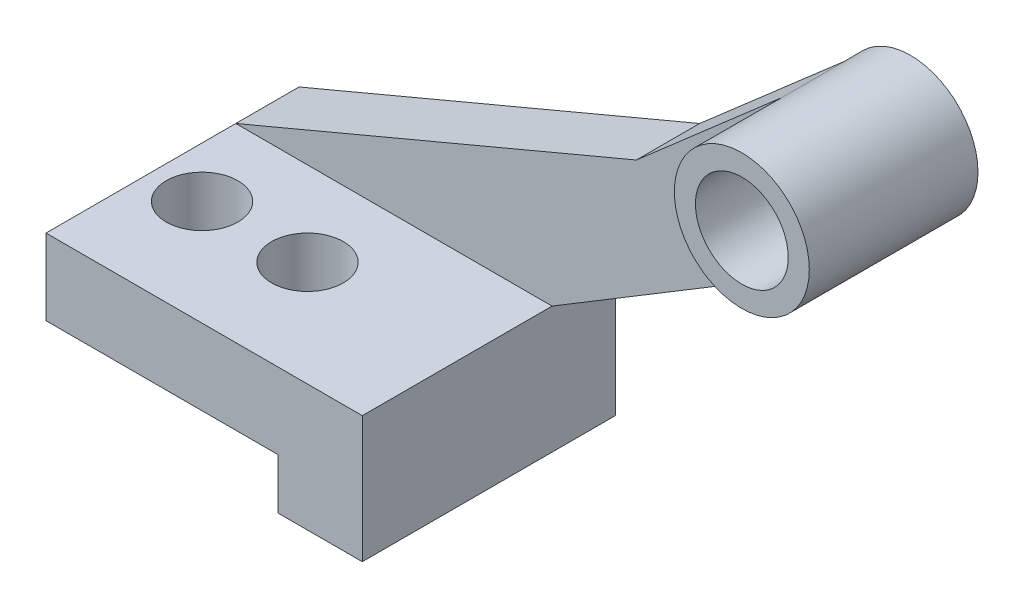
ISO-10303-21;
HEADER;
FILE_DESCRIPTION(('STEP AP214'),'2;1');
FILE_NAME('part.step','',(''),(''),'','','');
FILE_SCHEMA(('AUTOMOTIVE_DESIGN { 1 0 10303 214 1 1 1 1 }'));
ENDSEC;
DATA;
#1=APPLICATION_CONTEXT('core data for automotive mechanical design processes');
#2=APPLICATION_PROTOCOL_DEFINITION('international standard','automotive_design',2000,#1);
#3=PRODUCT_CONTEXT('',#1,'mechanical');
#4=PRODUCT('Part','Part','',(#3));
#5=PRODUCT_RELATED_PRODUCT_CATEGORY('part','',(#4));
#6=PRODUCT_DEFINITION_FORMATION('','',#4);
#7=PRODUCT_DEFINITION_CONTEXT('part definition',#1,'design');
#8=PRODUCT_DEFINITION('design','',#6,#7);
#9=PRODUCT_DEFINITION_SHAPE('','',#8);
#10=(LENGTH_UNIT() NAMED_UNIT(*) SI_UNIT(.MILLI.,.METRE.));
#11=(NAMED_UNIT(*) PLANE_ANGLE_UNIT() SI_UNIT($,.RADIAN.));
#12=(NAMED_UNIT(*) SI_UNIT($,.STERADIAN.) SOLID_ANGLE_UNIT());
#13=UNCERTAINTY_MEASURE_WITH_UNIT(LENGTH_MEASURE(1.E-05),#10,'distance_accuracy_value','');
#14=(GEOMETRIC_REPRESENTATION_CONTEXT(3) GLOBAL_UNCERTAINTY_ASSIGNED_CONTEXT((#13)) GLOBAL_UNIT_ASSIGNED_CONTEXT((#10,
#11,#12)) REPRESENTATION_CONTEXT('',''));
#15=CARTESIAN_POINT('',(0.,0.,0.));
#16=DIRECTION('',(0.,0.,1.));
#17=DIRECTION('',(1.,0.,0.));
#18=AXIS2_PLACEMENT_3D('',#15,#16,#17);
#19=CARTESIAN_POINT('',(0.,-18.1084401564552,60.));
#20=DIRECTION('',(0.,-1.,0.));
#21=DIRECTION('',(0.,0.,-1.));
#22=AXIS2_PLACEMENT_3D('',#19,#20,#21);
#23=PLANE('',#22);
#24=CARTESIAN_POINT('',(-50.7319838753452,-18.1084401564552,35.));
#25=DIRECTION('',(0.,1.,0.));
#26=DIRECTION('',(0.,0.,1.));
#27=AXIS2_PLACEMENT_3D('',#24,#25,#26);
#28=CIRCLE('',#27,8.5);
#29=CARTESIAN_POINT('',(-50.7319838753452,-18.1084401564552,43.5));
#30=VERTEX_POINT('',#29);
#31=EDGE_CURVE('E163',#30,#30,#28,.T.);
#32=ORIENTED_EDGE('',*,*,#31,.F.);
#33=EDGE_LOOP('',(#32));
#34=FACE_BOUND('',#33,.T.);
#35=CARTESIAN_POINT('',(-25.7319838753452,-18.1084401564552,35.));
#36=DIRECTION('',(0.,1.,0.));
#37=DIRECTION('',(0.,0.,1.));
#38=AXIS2_PLACEMENT_3D('',#35,#36,#37);
#39=CIRCLE('',#38,8.5);
#40=CARTESIAN_POINT('',(-25.7319838753452,-18.1084401564552,43.5));
#41=VERTEX_POINT('',#40);
#42=EDGE_CURVE('E171',#41,#41,#39,.T.);
#43=ORIENTED_EDGE('',*,*,#42,.F.);
#44=EDGE_LOOP('',(#43));
#45=FACE_BOUND('',#44,.T.);
#46=DIRECTION('',(0.,0.,-1.));
#47=VECTOR('',#46,1.);
#48=CARTESIAN_POINT('',(12.2680161246549,-18.1084401564552,60.));
#49=LINE('',#48,#47);
#50=CARTESIAN_POINT('',(12.2680161246549,-18.1084401564552,60.));
#51=VERTEX_POINT('',#50);
#52=CARTESIAN_POINT('',(12.2680161246549,-18.1084401564552,15.));
#53=VERTEX_POINT('',#52);
#54=EDGE_CURVE('E131',#51,#53,#49,.T.);
#55=ORIENTED_EDGE('',*,*,#54,.T.);
#56=DIRECTION('',(-1.,0.,0.));
#57=VECTOR('',#56,1.);
#58=CARTESIAN_POINT('',(0.,-18.1084401564552,15.));
#59=LINE('',#58,#57);
#60=CARTESIAN_POINT('',(-62.7319838753452,-18.1084401564552,15.));
#61=VERTEX_POINT('',#60);
#62=EDGE_CURVE('E207',#53,#61,#59,.T.);
#63=ORIENTED_EDGE('',*,*,#62,.T.);
#64=DIRECTION('',(0.,0.,-1.));
#65=VECTOR('',#64,1.);
#66=CARTESIAN_POINT('',(-62.7319838753452,-18.1084401564552,60.));
#67=LINE('',#66,#65);
#68=CARTESIAN_POINT('',(-62.7319838753452,-18.1084401564552,60.));
#69=VERTEX_POINT('',#68);
#70=EDGE_CURVE('E11',#69,#61,#67,.T.);
#71=ORIENTED_EDGE('',*,*,#70,.F.);
#72=DIRECTION('',(-1.,0.,0.));
#73=VECTOR('',#72,1.);
#74=CARTESIAN_POINT('',(0.,-18.1084401564552,60.));
#75=LINE('',#74,#73);
#76=EDGE_CURVE('E150',#51,#69,#75,.T.);
#77=ORIENTED_EDGE('',*,*,#76,.F.);
#78=EDGE_LOOP('',(#55,#63,#71,#77));
#79=FACE_BOUND('',#78,.T.);
#80=ADVANCED_FACE('F41',(#34,#45,#79),#23,.F.);
#81=CARTESIAN_POINT('',(-62.7319838753452,0.,60.));
#82=DIRECTION('',(1.,0.,0.));
#83=DIRECTION('',(0.,0.,-1.));
#84=AXIS2_PLACEMENT_3D('',#81,#82,#83);
#85=PLANE('',#84);
#86=DIRECTION('',(0.,-1.,0.));
#87=VECTOR('',#86,1.);
#88=CARTESIAN_POINT('',(-62.7319838753452,0.,0.));
#89=LINE('',#88,#87);
#90=CARTESIAN_POINT('',(-62.7319838753452,-18.1084401564552,0.));
#91=VERTEX_POINT('',#90);
#92=CARTESIAN_POINT('',(-62.7319838753452,-36.1084401564552,0.));
#93=VERTEX_POINT('',#92);
#94=EDGE_CURVE('E135',#91,#93,#89,.T.);
#95=ORIENTED_EDGE('',*,*,#94,.T.);
#96=DIRECTION('',(0.,0.,-1.));
#97=VECTOR('',#96,1.);
#98=CARTESIAN_POINT('',(-62.7319838753452,-36.1084401564552,60.));
#99=LINE('',#98,#97);
#100=CARTESIAN_POINT('',(-62.7319838753452,-36.1084401564552,60.));
#101=VERTEX_POINT('',#100);
#102=EDGE_CURVE('E50',#101,#93,#99,.T.);
#103=ORIENTED_EDGE('',*,*,#102,.F.);
#104=DIRECTION('',(0.,-1.,0.));
#105=VECTOR('',#104,1.);
#106=CARTESIAN_POINT('',(-62.7319838753452,0.,60.));
#107=LINE('',#106,#105);
#108=EDGE_CURVE('E97',#69,#101,#107,.T.);
#109=ORIENTED_EDGE('',*,*,#108,.F.);
#110=ORIENTED_EDGE('',*,*,#70,.T.);
#111=DIRECTION('',(0.,0.,-1.));
#112=VECTOR('',#111,1.);
#113=CARTESIAN_POINT('',(-62.7319838753452,-18.1084401564552,15.));
#114=LINE('',#113,#112);
#115=EDGE_CURVE('E58',#61,#91,#114,.T.);
#116=ORIENTED_EDGE('',*,*,#115,.T.);
#117=EDGE_LOOP('',(#95,#103,#109,#110,#116));
#118=FACE_BOUND('',#117,.T.);
#119=ADVANCED_FACE('F251',(#118),#85,.F.);
#120=CARTESIAN_POINT('',(0.,-36.1084401564552,60.));
#121=DIRECTION('',(0.,1.,0.));
#122=DIRECTION('',(0.,0.,1.));
#123=AXIS2_PLACEMENT_3D('',#120,#121,#122);
#124=PLANE('',#123);
#125=CARTESIAN_POINT('',(-50.7319838753452,-36.1084401564552,35.));
#126=DIRECTION('',(0.,1.,0.));
#127=DIRECTION('',(0.,0.,1.));
#128=AXIS2_PLACEMENT_3D('',#125,#126,#127);
#129=CIRCLE('',#128,8.5);
#130=CARTESIAN_POINT('',(-50.7319838753452,-36.1084401564552,43.5));
#131=VERTEX_POINT('',#130);
#132=EDGE_CURVE('E44',#131,#131,#129,.T.);
#133=ORIENTED_EDGE('',*,*,#132,.T.);
#134=EDGE_LOOP('',(#133));
#135=FACE_BOUND('',#134,.T.);
#136=CARTESIAN_POINT('',(-25.7319838753452,-36.1084401564552,35.));
#137=DIRECTION('',(0.,1.,0.));
#138=DIRECTION('',(0.,0.,1.));
#139=AXIS2_PLACEMENT_3D('',#136,#137,#138);
#140=CIRCLE('',#139,8.5);
#141=CARTESIAN_POINT('',(-25.7319838753452,-36.1084401564552,43.5));
#142=VERTEX_POINT('',#141);
#143=EDGE_CURVE('E160',#142,#142,#140,.T.);
#144=ORIENTED_EDGE('',*,*,#143,.T.);
#145=EDGE_LOOP('',(#144));
#146=FACE_BOUND('',#145,.T.);
#147=DIRECTION('',(1.,0.,0.));
#148=VECTOR('',#147,1.);
#149=CARTESIAN_POINT('',(0.,-36.1084401564552,0.));
#150=LINE('',#149,#148);
#151=CARTESIAN_POINT('',(-7.73198387534515,-36.1084401564552,0.));
#152=VERTEX_POINT('',#151);
#153=EDGE_CURVE('E138',#93,#152,#150,.T.);
#154=ORIENTED_EDGE('',*,*,#153,.T.);
#155=DIRECTION('',(0.,0.,-1.));
#156=VECTOR('',#155,1.);
#157=CARTESIAN_POINT('',(-7.73198387534515,-36.1084401564552,60.));
#158=LINE('',#157,#156);
#159=CARTESIAN_POINT('',(-7.73198387534515,-36.1084401564552,60.));
#160=VERTEX_POINT('',#159);
#161=EDGE_CURVE('E124',#160,#152,#158,.T.);
#162=ORIENTED_EDGE('',*,*,#161,.F.);
#163=DIRECTION('',(1.,0.,0.));
#164=VECTOR('',#163,1.);
#165=CARTESIAN_POINT('',(0.,-36.1084401564552,60.));
#166=LINE('',#165,#164);
#167=EDGE_CURVE('E113',#101,#160,#166,.T.);
#168=ORIENTED_EDGE('',*,*,#167,.F.);
#169=ORIENTED_EDGE('',*,*,#102,.T.);
#170=EDGE_LOOP('',(#154,#162,#168,#169));
#171=FACE_BOUND('',#170,.T.);
#172=ADVANCED_FACE('F255',(#135,#146,#171),#124,.F.);
#173=CARTESIAN_POINT('',(-7.73198387534515,0.,60.));
#174=DIRECTION('',(1.,0.,0.));
#175=DIRECTION('',(0.,0.,-1.));
#176=AXIS2_PLACEMENT_3D('',#173,#174,#175);
#177=PLANE('',#176);
#178=DIRECTION('',(0.,-1.,0.));
#179=VECTOR('',#178,1.);
#180=CARTESIAN_POINT('',(-7.73198387534515,0.,0.));
#181=LINE('',#180,#179);
#182=CARTESIAN_POINT('',(-7.73198387534515,-48.1084401564552,0.));
#183=VERTEX_POINT('',#182);
#184=EDGE_CURVE('E122',#152,#183,#181,.T.);
#185=ORIENTED_EDGE('',*,*,#184,.T.);
#186=DIRECTION('',(0.,0.,-1.));
#187=VECTOR('',#186,1.);
#188=CARTESIAN_POINT('',(-7.73198387534515,-48.1084401564552,60.));
#189=LINE('',#188,#187);
#190=CARTESIAN_POINT('',(-7.73198387534515,-48.1084401564552,60.));
#191=VERTEX_POINT('',#190);
#192=EDGE_CURVE('E119',#191,#183,#189,.T.);
#193=ORIENTED_EDGE('',*,*,#192,.F.);
#194=DIRECTION('',(0.,-1.,0.));
#195=VECTOR('',#194,1.);
#196=CARTESIAN_POINT('',(-7.73198387534515,0.,60.));
#197=LINE('',#196,#195);
#198=EDGE_CURVE('E107',#160,#191,#197,.T.);
#199=ORIENTED_EDGE('',*,*,#198,.F.);
#200=ORIENTED_EDGE('',*,*,#161,.T.);
#201=EDGE_LOOP('',(#185,#193,#199,#200));
#202=FACE_BOUND('',#201,.T.);
#203=ADVANCED_FACE('F120',(#202),#177,.F.);
#204=CARTESIAN_POINT('',(0.,-48.1084401564552,60.));
#205=DIRECTION('',(0.,1.,0.));
#206=DIRECTION('',(0.,0.,1.));
#207=AXIS2_PLACEMENT_3D('',#204,#205,#206);
#208=PLANE('',#207);
#209=DIRECTION('',(1.,0.,0.));
#210=VECTOR('',#209,1.);
#211=CARTESIAN_POINT('',(0.,-48.1084401564552,0.));
#212=LINE('',#211,#210);
#213=CARTESIAN_POINT('',(12.2680161246549,-48.1084401564552,0.));
#214=VERTEX_POINT('',#213);
#215=EDGE_CURVE('E89',#183,#214,#212,.T.);
#216=ORIENTED_EDGE('',*,*,#215,.T.);
#217=DIRECTION('',(0.,0.,-1.));
#218=VECTOR('',#217,1.);
#219=CARTESIAN_POINT('',(12.2680161246549,-48.1084401564552,60.));
#220=LINE('',#219,#218);
#221=CARTESIAN_POINT('',(12.2680161246549,-48.1084401564552,60.));
#222=VERTEX_POINT('',#221);
#223=EDGE_CURVE('E125',#222,#214,#220,.T.);
#224=ORIENTED_EDGE('',*,*,#223,.F.);
#225=DIRECTION('',(1.,0.,0.));
#226=VECTOR('',#225,1.);
#227=CARTESIAN_POINT('',(0.,-48.1084401564552,60.));
#228=LINE('',#227,#226);
#229=EDGE_CURVE('E111',#191,#222,#228,.T.);
#230=ORIENTED_EDGE('',*,*,#229,.F.);
#231=ORIENTED_EDGE('',*,*,#192,.T.);
#232=EDGE_LOOP('',(#216,#224,#230,#231));
#233=FACE_BOUND('',#232,.T.);
#234=ADVANCED_FACE('F127',(#233),#208,.F.);
#235=CARTESIAN_POINT('',(12.2680161246549,0.,60.));
#236=DIRECTION('',(-1.,0.,0.));
#237=DIRECTION('',(0.,0.,1.));
#238=AXIS2_PLACEMENT_3D('',#235,#236,#237);
#239=PLANE('',#238);
#240=DIRECTION('',(0.,1.,0.));
#241=VECTOR('',#240,1.);
#242=CARTESIAN_POINT('',(12.2680161246549,0.,0.));
#243=LINE('',#242,#241);
#244=CARTESIAN_POINT('',(12.2680161246549,-18.1084401564552,0.));
#245=VERTEX_POINT('',#244);
#246=EDGE_CURVE('E146',#214,#245,#243,.T.);
#247=ORIENTED_EDGE('',*,*,#246,.T.);
#248=DIRECTION('',(0.,0.,-1.));
#249=VECTOR('',#248,1.);
#250=CARTESIAN_POINT('',(12.2680161246549,-18.1084401564552,15.));
#251=LINE('',#250,#249);
#252=EDGE_CURVE('E232',#53,#245,#251,.T.);
#253=ORIENTED_EDGE('',*,*,#252,.F.);
#254=ORIENTED_EDGE('',*,*,#54,.F.);
#255=DIRECTION('',(0.,1.,0.));
#256=VECTOR('',#255,1.);
#257=CARTESIAN_POINT('',(12.2680161246549,0.,60.));
#258=LINE('',#257,#256);
#259=EDGE_CURVE('E67',#222,#51,#258,.T.);
#260=ORIENTED_EDGE('',*,*,#259,.F.);
#261=ORIENTED_EDGE('',*,*,#223,.T.);
#262=EDGE_LOOP('',(#247,#253,#254,#260,#261));
#263=FACE_BOUND('',#262,.T.);
#264=ADVANCED_FACE('F263',(#263),#239,.F.);
#265=CARTESIAN_POINT('',(0.,0.,60.));
#266=DIRECTION('',(0.,0.,1.));
#267=DIRECTION('',(1.,0.,0.));
#268=AXIS2_PLACEMENT_3D('',#265,#266,#267);
#269=PLANE('',#268);
#270=ORIENTED_EDGE('',*,*,#76,.T.);
#271=ORIENTED_EDGE('',*,*,#108,.T.);
#272=ORIENTED_EDGE('',*,*,#167,.T.);
#273=ORIENTED_EDGE('',*,*,#198,.T.);
#274=ORIENTED_EDGE('',*,*,#229,.T.);
#275=ORIENTED_EDGE('',*,*,#259,.T.);
#276=EDGE_LOOP('',(#270,#271,#272,#273,#274,#275));
#277=FACE_BOUND('',#276,.T.);
#278=ADVANCED_FACE('F109',(#277),#269,.T.);
#279=CARTESIAN_POINT('',(0.,0.,0.));
#280=DIRECTION('',(0.,0.,1.));
#281=DIRECTION('',(1.,0.,0.));
#282=AXIS2_PLACEMENT_3D('',#279,#280,#281);
#283=PLANE('',#282);
#284=ORIENTED_EDGE('',*,*,#94,.F.);
#285=DIRECTION('',(-0.921635375138065,-0.388057000058133,0.));
#286=VECTOR('',#285,1.);
#287=CARTESIAN_POINT('',(-2.97026838644918,7.05438741781681,0.));
#288=LINE('',#287,#286);
#289=CARTESIAN_POINT('',(32.2680161246548,21.8915598435448,0.));
#290=VERTEX_POINT('',#289);
#291=EDGE_CURVE('E223',#290,#91,#288,.T.);
#292=ORIENTED_EDGE('',*,*,#291,.F.);
#293=DIRECTION('',(0.753818677380156,0.657082492258645,0.));
#294=VECTOR('',#293,1.);
#295=CARTESIAN_POINT('',(3.08860427518401,-3.54331094969039,0.));
#296=LINE('',#295,#294);
#297=CARTESIAN_POINT('',(66.7547069643019,51.9526361297202,0.));
#298=VERTEX_POINT('',#297);
#299=EDGE_CURVE('E219',#290,#298,#296,.T.);
#300=ORIENTED_EDGE('',*,*,#299,.T.);
#301=CARTESIAN_POINT('',(77.2680198874391,39.8915452682649,0.));
#302=DIRECTION('',(0.,0.,1.));
#303=DIRECTION('',(1.,0.,0.));
#304=AXIS2_PLACEMENT_3D('',#301,#302,#303);
#305=CIRCLE('',#304,15.9999894182488);
#306=CARTESIAN_POINT('',(85.5467548820578,26.1998613587904,0.));
#307=VERTEX_POINT('',#306);
#308=EDGE_CURVE('E194',#298,#307,#305,.T.);
#309=ORIENTED_EDGE('',*,*,#308,.T.);
#310=DIRECTION('',(0.855730810281107,0.517421279361065,0.));
#311=VECTOR('',#310,1.);
#312=CARTESIAN_POINT('',(11.3023862829745,-18.6923123532589,0.));
#313=LINE('',#312,#311);
#314=EDGE_CURVE('E200',#245,#307,#313,.T.);
#315=ORIENTED_EDGE('',*,*,#314,.F.);
#316=ORIENTED_EDGE('',*,*,#246,.F.);
#317=ORIENTED_EDGE('',*,*,#215,.F.);
#318=ORIENTED_EDGE('',*,*,#184,.F.);
#319=ORIENTED_EDGE('',*,*,#153,.F.);
#320=EDGE_LOOP('',(#284,#292,#300,#309,#315,#316,#317,#318,#319));
#321=FACE_BOUND('',#320,.T.);
#322=ADVANCED_FACE('F257',(#321),#283,.F.);
#323=CARTESIAN_POINT('',(3.08860427518401,-3.54331094969039,15.));
#324=DIRECTION('',(-0.657082492258645,0.753818677380156,0.));
#325=DIRECTION('',(-0.753818677380156,-0.657082492258645,0.));
#326=AXIS2_PLACEMENT_3D('',#323,#324,#325);
#327=PLANE('',#326);
#328=ORIENTED_EDGE('',*,*,#299,.F.);
#329=DIRECTION('',(0.,0.,-1.));
#330=VECTOR('',#329,1.);
#331=CARTESIAN_POINT('',(32.2680161246548,21.8915598435448,15.));
#332=LINE('',#331,#330);
#333=CARTESIAN_POINT('',(32.2680161246548,21.8915598435448,15.));
#334=VERTEX_POINT('',#333);
#335=EDGE_CURVE('E238',#334,#290,#332,.T.);
#336=ORIENTED_EDGE('',*,*,#335,.F.);
#337=DIRECTION('',(0.753818677380156,0.657082492258645,0.));
#338=VECTOR('',#337,1.);
#339=CARTESIAN_POINT('',(3.08860427518401,-3.54331094969039,15.));
#340=LINE('',#339,#338);
#341=CARTESIAN_POINT('',(66.7547069643019,51.9526361297202,15.));
#342=VERTEX_POINT('',#341);
#343=EDGE_CURVE('E199',#334,#342,#340,.T.);
#344=ORIENTED_EDGE('',*,*,#343,.T.);
#345=DIRECTION('',(0.,0.,-1.));
#346=VECTOR('',#345,1.);
#347=CARTESIAN_POINT('',(66.7547069643019,51.9526361297202,15.));
#348=LINE('',#347,#346);
#349=EDGE_CURVE('E139',#342,#298,#348,.T.);
#350=ORIENTED_EDGE('',*,*,#349,.T.);
#351=EDGE_LOOP('',(#328,#336,#344,#350));
#352=FACE_BOUND('',#351,.T.);
#353=ADVANCED_FACE('F293',(#352),#327,.T.);
#354=CARTESIAN_POINT('',(-2.97026838644918,7.05438741781681,15.));
#355=DIRECTION('',(0.388057000058133,-0.921635375138065,0.));
#356=DIRECTION('',(0.921635375138065,0.388057000058133,0.));
#357=AXIS2_PLACEMENT_3D('',#354,#355,#356);
#358=PLANE('',#357);
#359=ORIENTED_EDGE('',*,*,#291,.T.);
#360=ORIENTED_EDGE('',*,*,#115,.F.);
#361=DIRECTION('',(-0.921635375138065,-0.388057000058133,0.));
#362=VECTOR('',#361,1.);
#363=CARTESIAN_POINT('',(-2.97026838644918,7.05438741781681,15.));
#364=LINE('',#363,#362);
#365=EDGE_CURVE('E204',#334,#61,#364,.T.);
#366=ORIENTED_EDGE('',*,*,#365,.F.);
#367=ORIENTED_EDGE('',*,*,#335,.T.);
#368=EDGE_LOOP('',(#359,#360,#366,#367));
#369=FACE_BOUND('',#368,.T.);
#370=ADVANCED_FACE('F295',(#369),#358,.F.);
#371=CARTESIAN_POINT('',(11.3023862829745,-18.6923123532589,15.));
#372=DIRECTION('',(-0.517421279361065,0.855730810281106,0.));
#373=DIRECTION('',(-0.855730810281107,-0.517421279361065,0.));
#374=AXIS2_PLACEMENT_3D('',#371,#372,#373);
#375=PLANE('',#374);
#376=ORIENTED_EDGE('',*,*,#314,.T.);
#377=DIRECTION('',(0.,0.,-1.));
#378=VECTOR('',#377,1.);
#379=CARTESIAN_POINT('',(85.5467548820578,26.1998613587904,15.));
#380=LINE('',#379,#378);
#381=CARTESIAN_POINT('',(85.546754881993,26.1998613588977,15.));
#382=VERTEX_POINT('',#381);
#383=EDGE_CURVE('E215',#382,#307,#380,.T.);
#384=ORIENTED_EDGE('',*,*,#383,.F.);
#385=DIRECTION('',(0.855730810281107,0.517421279361065,0.));
#386=VECTOR('',#385,1.);
#387=CARTESIAN_POINT('',(11.3023862829745,-18.6923123532589,15.));
#388=LINE('',#387,#386);
#389=EDGE_CURVE('E211',#53,#382,#388,.T.);
#390=ORIENTED_EDGE('',*,*,#389,.F.);
#391=ORIENTED_EDGE('',*,*,#252,.T.);
#392=EDGE_LOOP('',(#376,#384,#390,#391));
#393=FACE_BOUND('',#392,.T.);
#394=ADVANCED_FACE('F282',(#393),#375,.F.);
#395=CARTESIAN_POINT('',(0.,0.,15.));
#396=DIRECTION('',(0.,0.,1.));
#397=DIRECTION('',(1.,0.,0.));
#398=AXIS2_PLACEMENT_3D('',#395,#396,#397);
#399=PLANE('',#398);
#400=CARTESIAN_POINT('',(77.2680198874391,39.8915452682649,15.));
#401=DIRECTION('',(0.,0.,1.));
#402=DIRECTION('',(1.,0.,0.));
#403=AXIS2_PLACEMENT_3D('',#400,#401,#402);
#404=CIRCLE('',#403,15.9999894182488);
#405=EDGE_CURVE('E195',#342,#382,#404,.T.);
#406=ORIENTED_EDGE('',*,*,#405,.F.);
#407=ORIENTED_EDGE('',*,*,#343,.F.);
#408=ORIENTED_EDGE('',*,*,#365,.T.);
#409=ORIENTED_EDGE('',*,*,#62,.F.);
#410=ORIENTED_EDGE('',*,*,#389,.T.);
#411=EDGE_LOOP('',(#406,#407,#408,#409,#410));
#412=FACE_BOUND('',#411,.T.);
#413=ADVANCED_FACE('F287',(#412),#399,.T.);
#414=CARTESIAN_POINT('',(77.2680198874391,39.8915452682649,-5.));
#415=DIRECTION('',(0.,0.,1.));
#416=DIRECTION('',(1.,0.,0.));
#417=AXIS2_PLACEMENT_3D('',#414,#415,#416);
#418=CYLINDRICAL_SURFACE('',#417,15.9999894182488);
#419=CARTESIAN_POINT('',(77.2680198874391,39.8915452682649,35.));
#420=DIRECTION('',(0.,0.,1.));
#421=DIRECTION('',(1.,0.,0.));
#422=AXIS2_PLACEMENT_3D('',#419,#420,#421);
#423=CIRCLE('',#422,15.9999894182488);
#424=CARTESIAN_POINT('',(93.268009305688,39.8915452682649,35.));
#425=VERTEX_POINT('',#424);
#426=EDGE_CURVE('E182',#425,#425,#423,.T.);
#427=ORIENTED_EDGE('',*,*,#426,.F.);
#428=EDGE_LOOP('',(#427));
#429=FACE_BOUND('',#428,.T.);
#430=CARTESIAN_POINT('',(77.2680198874391,39.8915452682649,-5.));
#431=DIRECTION('',(0.,0.,1.));
#432=DIRECTION('',(1.,0.,0.));
#433=AXIS2_PLACEMENT_3D('',#430,#431,#432);
#434=CIRCLE('',#433,15.9999894182488);
#435=CARTESIAN_POINT('',(93.268009305688,39.8915452682649,-5.));
#436=VERTEX_POINT('',#435);
#437=EDGE_CURVE('E190',#436,#436,#434,.T.);
#438=ORIENTED_EDGE('',*,*,#437,.T.);
#439=EDGE_LOOP('',(#438));
#440=FACE_BOUND('',#439,.T.);
#441=ORIENTED_EDGE('',*,*,#308,.F.);
#442=ORIENTED_EDGE('',*,*,#349,.F.);
#443=ORIENTED_EDGE('',*,*,#405,.T.);
#444=ORIENTED_EDGE('',*,*,#383,.T.);
#445=EDGE_LOOP('',(#441,#442,#443,#444));
#446=FACE_BOUND('',#445,.T.);
#447=ADVANCED_FACE('F290',(#429,#440,#446),#418,.T.);
#448=CARTESIAN_POINT('',(77.2680198874391,39.8915452682649,-5.));
#449=DIRECTION('',(0.,0.,1.));
#450=DIRECTION('',(1.,0.,0.));
#451=AXIS2_PLACEMENT_3D('',#448,#449,#450);
#452=CYLINDRICAL_SURFACE('',#451,10.9999999996838);
#453=CARTESIAN_POINT('',(77.2680198874391,39.8915452682649,-5.));
#454=DIRECTION('',(0.,0.,1.));
#455=DIRECTION('',(1.,0.,0.));
#456=AXIS2_PLACEMENT_3D('',#453,#454,#455);
#457=CIRCLE('',#456,10.9999999996838);
#458=CARTESIAN_POINT('',(88.2680198871229,39.8915452682649,-5.));
#459=VERTEX_POINT('',#458);
#460=EDGE_CURVE('E186',#459,#459,#457,.T.);
#461=ORIENTED_EDGE('',*,*,#460,.F.);
#462=EDGE_LOOP('',(#461));
#463=FACE_BOUND('',#462,.T.);
#464=CARTESIAN_POINT('',(77.2680198874391,39.8915452682649,35.));
#465=DIRECTION('',(0.,0.,1.));
#466=DIRECTION('',(1.,0.,0.));
#467=AXIS2_PLACEMENT_3D('',#464,#465,#466);
#468=CIRCLE('',#467,10.9999999996838);
#469=CARTESIAN_POINT('',(88.2680198871229,39.8915452682649,35.));
#470=VERTEX_POINT('',#469);
#471=EDGE_CURVE('E169',#470,#470,#468,.T.);
#472=ORIENTED_EDGE('',*,*,#471,.T.);
#473=EDGE_LOOP('',(#472));
#474=FACE_BOUND('',#473,.T.);
#475=ADVANCED_FACE('F322',(#463,#474),#452,.F.);
#476=CARTESIAN_POINT('',(0.,0.,-5.));
#477=DIRECTION('',(0.,0.,1.));
#478=DIRECTION('',(1.,0.,0.));
#479=AXIS2_PLACEMENT_3D('',#476,#477,#478);
#480=PLANE('',#479);
#481=ORIENTED_EDGE('',*,*,#460,.T.);
#482=EDGE_LOOP('',(#481));
#483=FACE_BOUND('',#482,.T.);
#484=ORIENTED_EDGE('',*,*,#437,.F.);
#485=EDGE_LOOP('',(#484));
#486=FACE_BOUND('',#485,.T.);
#487=ADVANCED_FACE('F316',(#483,#486),#480,.F.);
#488=CARTESIAN_POINT('',(0.,0.,35.));
#489=DIRECTION('',(0.,0.,1.));
#490=DIRECTION('',(1.,0.,0.));
#491=AXIS2_PLACEMENT_3D('',#488,#489,#490);
#492=PLANE('',#491);
#493=ORIENTED_EDGE('',*,*,#471,.F.);
#494=EDGE_LOOP('',(#493));
#495=FACE_BOUND('',#494,.T.);
#496=ORIENTED_EDGE('',*,*,#426,.T.);
#497=EDGE_LOOP('',(#496));
#498=FACE_BOUND('',#497,.T.);
#499=ADVANCED_FACE('F309',(#495,#498),#492,.T.);
#500=CARTESIAN_POINT('',(-25.7319838753452,-53.1084401564552,35.));
#501=DIRECTION('',(0.,1.,0.));
#502=DIRECTION('',(0.,0.,1.));
#503=AXIS2_PLACEMENT_3D('',#500,#501,#502);
#504=CYLINDRICAL_SURFACE('',#503,8.5);
#505=ORIENTED_EDGE('',*,*,#42,.T.);
#506=EDGE_LOOP('',(#505));
#507=FACE_BOUND('',#506,.T.);
#508=ORIENTED_EDGE('',*,*,#143,.F.);
#509=EDGE_LOOP('',(#508));
#510=FACE_BOUND('',#509,.T.);
#511=ADVANCED_FACE('F305',(#507,#510),#504,.F.);
#512=CARTESIAN_POINT('',(-50.7319838753452,-53.1084401564552,35.));
#513=DIRECTION('',(0.,1.,0.));
#514=DIRECTION('',(0.,0.,1.));
#515=AXIS2_PLACEMENT_3D('',#512,#513,#514);
#516=CYLINDRICAL_SURFACE('',#515,8.5);
#517=ORIENTED_EDGE('',*,*,#31,.T.);
#518=EDGE_LOOP('',(#517));
#519=FACE_BOUND('',#518,.T.);
#520=ORIENTED_EDGE('',*,*,#132,.F.);
#521=EDGE_LOOP('',(#520));
#522=FACE_BOUND('',#521,.T.);
#523=ADVANCED_FACE('F308',(#519,#522),#516,.F.);
#524=CLOSED_SHELL('',(#80,#119,#172,#203,#234,#264,#278,#322,#353,#370,#394,#413,#447,#475,#487,
#499,#511,#523));
#525=MANIFOLD_SOLID_BREP('B2',#524);
#526=ADVANCED_BREP_SHAPE_REPRESENTATION('',(#18,#525),#14);
#527=SHAPE_DEFINITION_REPRESENTATION(#9,#526);
ENDSEC;
END-ISO-10303-21;
